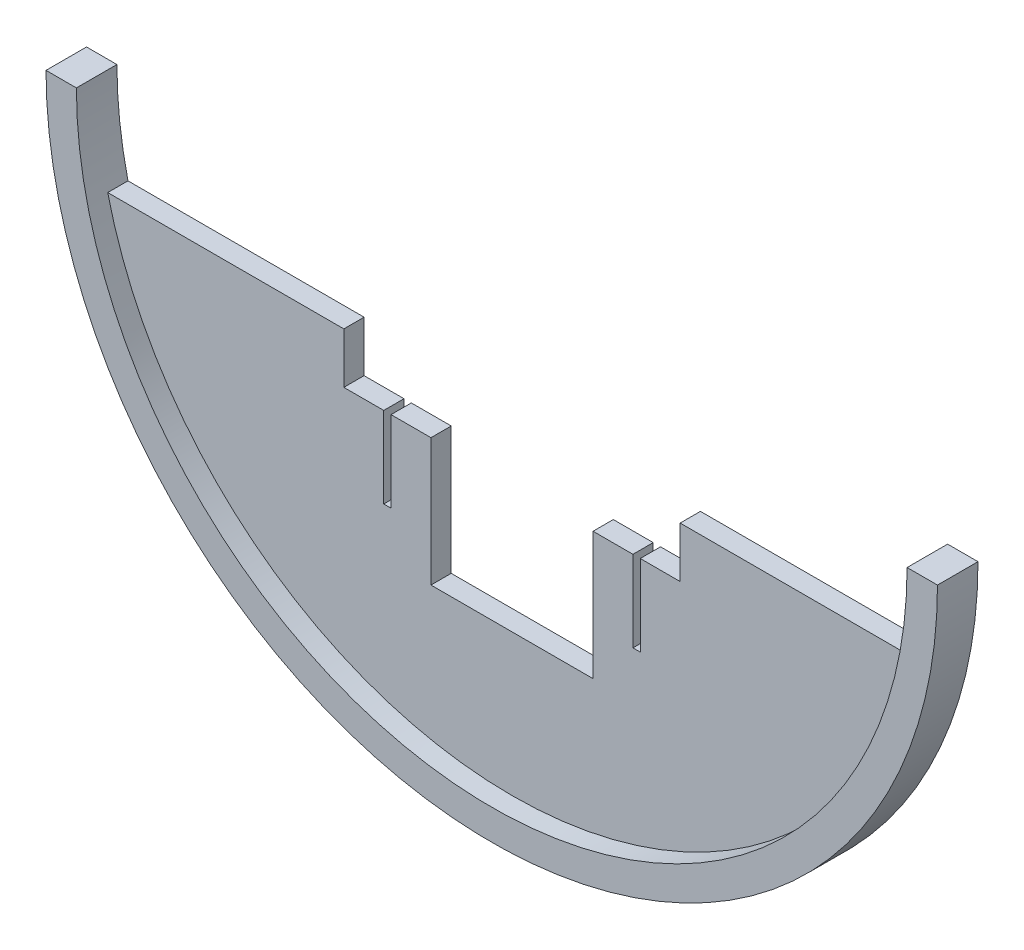
ISO-10303-21;
HEADER;
FILE_DESCRIPTION(('STEP AP214'),'2;1');
FILE_NAME('part.step','',(''),(''),'','','');
FILE_SCHEMA(('AUTOMOTIVE_DESIGN { 1 0 10303 214 1 1 1 1 }'));
ENDSEC;
DATA;
#1=APPLICATION_CONTEXT('core data for automotive mechanical design processes');
#2=APPLICATION_PROTOCOL_DEFINITION('international standard','automotive_design',2000,#1);
#3=PRODUCT_CONTEXT('',#1,'mechanical');
#4=PRODUCT('Part','Part','',(#3));
#5=PRODUCT_RELATED_PRODUCT_CATEGORY('part','',(#4));
#6=PRODUCT_DEFINITION_FORMATION('','',#4);
#7=PRODUCT_DEFINITION_CONTEXT('part definition',#1,'design');
#8=PRODUCT_DEFINITION('design','',#6,#7);
#9=PRODUCT_DEFINITION_SHAPE('','',#8);
#10=(LENGTH_UNIT() NAMED_UNIT(*) SI_UNIT(.MILLI.,.METRE.));
#11=(NAMED_UNIT(*) PLANE_ANGLE_UNIT() SI_UNIT($,.RADIAN.));
#12=(NAMED_UNIT(*) SI_UNIT($,.STERADIAN.) SOLID_ANGLE_UNIT());
#13=UNCERTAINTY_MEASURE_WITH_UNIT(LENGTH_MEASURE(1.E-05),#10,'distance_accuracy_value','');
#14=(GEOMETRIC_REPRESENTATION_CONTEXT(3) GLOBAL_UNCERTAINTY_ASSIGNED_CONTEXT((#13)) GLOBAL_UNIT_ASSIGNED_CONTEXT((#10,
#11,#12)) REPRESENTATION_CONTEXT('',''));
#15=CARTESIAN_POINT('',(0.,0.,0.));
#16=DIRECTION('',(0.,0.,1.));
#17=DIRECTION('',(1.,0.,0.));
#18=AXIS2_PLACEMENT_3D('',#15,#16,#17);
#19=CARTESIAN_POINT('',(0.,5.82014925373134,20.));
#20=DIRECTION('',(0.,1.,0.));
#21=DIRECTION('',(0.,0.,1.));
#22=AXIS2_PLACEMENT_3D('',#19,#20,#21);
#23=PLANE('',#22);
#24=DIRECTION('',(0.,0.,-1.));
#25=VECTOR('',#24,1.);
#26=CARTESIAN_POINT('',(272.3700514361,5.82014925373134,20.));
#27=LINE('',#26,#25);
#28=CARTESIAN_POINT('',(272.3700514361,5.82014925373134,10.));
#29=VERTEX_POINT('',#28);
#30=CARTESIAN_POINT('',(272.3700514361,5.82014925373134,0.));
#31=VERTEX_POINT('',#30);
#32=EDGE_CURVE('E215',#29,#31,#27,.T.);
#33=ORIENTED_EDGE('',*,*,#32,.F.);
#34=DIRECTION('',(-1.,0.,0.));
#35=VECTOR('',#34,1.);
#36=CARTESIAN_POINT('',(272.3700514361,5.82014925373134,10.));
#37=LINE('',#36,#35);
#38=CARTESIAN_POINT('',(388.909521215891,5.82014925373133,10.));
#39=VERTEX_POINT('',#38);
#40=EDGE_CURVE('E201',#39,#29,#37,.T.);
#41=ORIENTED_EDGE('',*,*,#40,.F.);
#42=DIRECTION('',(0.,0.,-1.));
#43=VECTOR('',#42,1.);
#44=CARTESIAN_POINT('',(388.909521215891,5.82014925373133,20.));
#45=LINE('',#44,#43);
#46=CARTESIAN_POINT('',(388.909521215891,5.82014925373133,0.));
#47=VERTEX_POINT('',#46);
#48=EDGE_CURVE('E213',#39,#47,#45,.T.);
#49=ORIENTED_EDGE('',*,*,#48,.T.);
#50=DIRECTION('',(1.,0.,0.));
#51=VECTOR('',#50,1.);
#52=CARTESIAN_POINT('',(0.,5.82014925373134,0.));
#53=LINE('',#52,#51);
#54=EDGE_CURVE('E353',#31,#47,#53,.T.);
#55=ORIENTED_EDGE('',*,*,#54,.F.);
#56=EDGE_LOOP('',(#33,#41,#49,#55));
#57=FACE_BOUND('',#56,.T.);
#58=ADVANCED_FACE('F44',(#57),#23,.T.);
#59=CARTESIAN_POINT('',(272.3700514361,0.,20.));
#60=DIRECTION('',(-1.,0.,0.));
#61=DIRECTION('',(0.,0.,1.));
#62=AXIS2_PLACEMENT_3D('',#59,#60,#61);
#63=PLANE('',#62);
#64=DIRECTION('',(0.,0.,-1.));
#65=VECTOR('',#64,1.);
#66=CARTESIAN_POINT('',(272.3700514361,-19.1798507462687,20.));
#67=LINE('',#66,#65);
#68=CARTESIAN_POINT('',(272.3700514361,-19.1798507462687,10.));
#69=VERTEX_POINT('',#68);
#70=CARTESIAN_POINT('',(272.3700514361,-19.1798507462687,0.));
#71=VERTEX_POINT('',#70);
#72=EDGE_CURVE('E228',#69,#71,#67,.T.);
#73=ORIENTED_EDGE('',*,*,#72,.F.);
#74=DIRECTION('',(0.,-1.,0.));
#75=VECTOR('',#74,1.);
#76=CARTESIAN_POINT('',(272.3700514361,-19.1798507462687,10.));
#77=LINE('',#76,#75);
#78=EDGE_CURVE('E217',#29,#69,#77,.T.);
#79=ORIENTED_EDGE('',*,*,#78,.F.);
#80=ORIENTED_EDGE('',*,*,#32,.T.);
#81=DIRECTION('',(0.,1.,0.));
#82=VECTOR('',#81,1.);
#83=CARTESIAN_POINT('',(272.3700514361,0.,0.));
#84=LINE('',#83,#82);
#85=EDGE_CURVE('E349',#71,#31,#84,.T.);
#86=ORIENTED_EDGE('',*,*,#85,.F.);
#87=EDGE_LOOP('',(#73,#79,#80,#86));
#88=FACE_BOUND('',#87,.T.);
#89=ADVANCED_FACE('F432',(#88),#63,.T.);
#90=CARTESIAN_POINT('',(0.,-19.1798507462687,20.));
#91=DIRECTION('',(0.,1.,0.));
#92=DIRECTION('',(0.,0.,1.));
#93=AXIS2_PLACEMENT_3D('',#90,#91,#92);
#94=PLANE('',#93);
#95=DIRECTION('',(0.,0.,-1.));
#96=VECTOR('',#95,1.);
#97=CARTESIAN_POINT('',(252.6700514361,-19.1798507462687,20.));
#98=LINE('',#97,#96);
#99=CARTESIAN_POINT('',(252.6700514361,-19.1798507462687,10.));
#100=VERTEX_POINT('',#99);
#101=CARTESIAN_POINT('',(252.6700514361,-19.1798507462687,0.));
#102=VERTEX_POINT('',#101);
#103=EDGE_CURVE('E233',#100,#102,#98,.T.);
#104=ORIENTED_EDGE('',*,*,#103,.F.);
#105=DIRECTION('',(-1.,0.,0.));
#106=VECTOR('',#105,1.);
#107=CARTESIAN_POINT('',(252.6700514361,-19.1798507462687,10.));
#108=LINE('',#107,#106);
#109=EDGE_CURVE('E419',#69,#100,#108,.T.);
#110=ORIENTED_EDGE('',*,*,#109,.F.);
#111=ORIENTED_EDGE('',*,*,#72,.T.);
#112=DIRECTION('',(1.,0.,0.));
#113=VECTOR('',#112,1.);
#114=CARTESIAN_POINT('',(0.,-19.1798507462687,0.));
#115=LINE('',#114,#113);
#116=EDGE_CURVE('E345',#102,#71,#115,.T.);
#117=ORIENTED_EDGE('',*,*,#116,.F.);
#118=EDGE_LOOP('',(#104,#110,#111,#117));
#119=FACE_BOUND('',#118,.T.);
#120=ADVANCED_FACE('F429',(#119),#94,.T.);
#121=CARTESIAN_POINT('',(252.6700514361,0.,20.));
#122=DIRECTION('',(1.,0.,0.));
#123=DIRECTION('',(0.,0.,-1.));
#124=AXIS2_PLACEMENT_3D('',#121,#122,#123);
#125=PLANE('',#124);
#126=DIRECTION('',(0.,-1.,0.));
#127=VECTOR('',#126,1.);
#128=CARTESIAN_POINT('',(252.6700514361,-59.1798507462687,10.));
#129=LINE('',#128,#127);
#130=CARTESIAN_POINT('',(252.6700514361,-59.1798507462687,10.));
#131=VERTEX_POINT('',#130);
#132=EDGE_CURVE('E416',#100,#131,#129,.T.);
#133=ORIENTED_EDGE('',*,*,#132,.F.);
#134=ORIENTED_EDGE('',*,*,#103,.T.);
#135=DIRECTION('',(0.,-1.,0.));
#136=VECTOR('',#135,1.);
#137=CARTESIAN_POINT('',(252.6700514361,0.,0.));
#138=LINE('',#137,#136);
#139=CARTESIAN_POINT('',(252.6700514361,-59.1798507462687,0.));
#140=VERTEX_POINT('',#139);
#141=EDGE_CURVE('E341',#102,#140,#138,.T.);
#142=ORIENTED_EDGE('',*,*,#141,.T.);
#143=DIRECTION('',(0.,0.,-1.));
#144=VECTOR('',#143,1.);
#145=CARTESIAN_POINT('',(252.6700514361,-59.1798507462687,20.));
#146=LINE('',#145,#144);
#147=EDGE_CURVE('E236',#131,#140,#146,.T.);
#148=ORIENTED_EDGE('',*,*,#147,.F.);
#149=EDGE_LOOP('',(#133,#134,#142,#148));
#150=FACE_BOUND('',#149,.T.);
#151=ADVANCED_FACE('F440',(#150),#125,.F.);
#152=CARTESIAN_POINT('',(0.,-59.1798507462687,20.));
#153=DIRECTION('',(0.,1.,0.));
#154=DIRECTION('',(0.,0.,1.));
#155=AXIS2_PLACEMENT_3D('',#152,#153,#154);
#156=PLANE('',#155);
#157=DIRECTION('',(0.,0.,-1.));
#158=VECTOR('',#157,1.);
#159=CARTESIAN_POINT('',(249.0700514361,-59.1798507462687,20.));
#160=LINE('',#159,#158);
#161=CARTESIAN_POINT('',(249.0700514361,-59.1798507462687,10.));
#162=VERTEX_POINT('',#161);
#163=CARTESIAN_POINT('',(249.0700514361,-59.1798507462687,0.));
#164=VERTEX_POINT('',#163);
#165=EDGE_CURVE('E239',#162,#164,#160,.T.);
#166=ORIENTED_EDGE('',*,*,#165,.F.);
#167=DIRECTION('',(-1.,0.,0.));
#168=VECTOR('',#167,1.);
#169=CARTESIAN_POINT('',(249.0700514361,-59.1798507462687,10.));
#170=LINE('',#169,#168);
#171=EDGE_CURVE('E413',#131,#162,#170,.T.);
#172=ORIENTED_EDGE('',*,*,#171,.F.);
#173=ORIENTED_EDGE('',*,*,#147,.T.);
#174=DIRECTION('',(1.,0.,0.));
#175=VECTOR('',#174,1.);
#176=CARTESIAN_POINT('',(0.,-59.1798507462687,0.));
#177=LINE('',#176,#175);
#178=EDGE_CURVE('E337',#164,#140,#177,.T.);
#179=ORIENTED_EDGE('',*,*,#178,.F.);
#180=EDGE_LOOP('',(#166,#172,#173,#179));
#181=FACE_BOUND('',#180,.T.);
#182=ADVANCED_FACE('F445',(#181),#156,.T.);
#183=CARTESIAN_POINT('',(249.0700514361,0.,20.));
#184=DIRECTION('',(1.,0.,0.));
#185=DIRECTION('',(0.,0.,-1.));
#186=AXIS2_PLACEMENT_3D('',#183,#184,#185);
#187=PLANE('',#186);
#188=DIRECTION('',(0.,0.,-1.));
#189=VECTOR('',#188,1.);
#190=CARTESIAN_POINT('',(249.0700514361,-19.1798507462687,20.));
#191=LINE('',#190,#189);
#192=CARTESIAN_POINT('',(249.0700514361,-19.1798507462687,10.));
#193=VERTEX_POINT('',#192);
#194=CARTESIAN_POINT('',(249.0700514361,-19.1798507462687,0.));
#195=VERTEX_POINT('',#194);
#196=EDGE_CURVE('E242',#193,#195,#191,.T.);
#197=ORIENTED_EDGE('',*,*,#196,.F.);
#198=DIRECTION('',(0.,1.,0.));
#199=VECTOR('',#198,1.);
#200=CARTESIAN_POINT('',(249.0700514361,-19.1798507462687,10.));
#201=LINE('',#200,#199);
#202=EDGE_CURVE('E410',#162,#193,#201,.T.);
#203=ORIENTED_EDGE('',*,*,#202,.F.);
#204=ORIENTED_EDGE('',*,*,#165,.T.);
#205=DIRECTION('',(0.,-1.,0.));
#206=VECTOR('',#205,1.);
#207=CARTESIAN_POINT('',(249.0700514361,0.,0.));
#208=LINE('',#207,#206);
#209=EDGE_CURVE('E333',#195,#164,#208,.T.);
#210=ORIENTED_EDGE('',*,*,#209,.F.);
#211=EDGE_LOOP('',(#197,#203,#204,#210));
#212=FACE_BOUND('',#211,.T.);
#213=ADVANCED_FACE('F449',(#212),#187,.T.);
#214=CARTESIAN_POINT('',(0.,-19.1798507462687,20.));
#215=DIRECTION('',(0.,1.,0.));
#216=DIRECTION('',(0.,0.,1.));
#217=AXIS2_PLACEMENT_3D('',#214,#215,#216);
#218=PLANE('',#217);
#219=DIRECTION('',(0.,0.,-1.));
#220=VECTOR('',#219,1.);
#221=CARTESIAN_POINT('',(229.3700514361,-19.1798507462687,20.));
#222=LINE('',#221,#220);
#223=CARTESIAN_POINT('',(229.3700514361,-19.1798507462687,10.));
#224=VERTEX_POINT('',#223);
#225=CARTESIAN_POINT('',(229.3700514361,-19.1798507462687,0.));
#226=VERTEX_POINT('',#225);
#227=EDGE_CURVE('E245',#224,#226,#222,.T.);
#228=ORIENTED_EDGE('',*,*,#227,.F.);
#229=DIRECTION('',(-1.,0.,0.));
#230=VECTOR('',#229,1.);
#231=CARTESIAN_POINT('',(229.3700514361,-19.1798507462687,10.));
#232=LINE('',#231,#230);
#233=EDGE_CURVE('E407',#193,#224,#232,.T.);
#234=ORIENTED_EDGE('',*,*,#233,.F.);
#235=ORIENTED_EDGE('',*,*,#196,.T.);
#236=DIRECTION('',(1.,0.,0.));
#237=VECTOR('',#236,1.);
#238=CARTESIAN_POINT('',(0.,-19.1798507462687,0.));
#239=LINE('',#238,#237);
#240=EDGE_CURVE('E329',#226,#195,#239,.T.);
#241=ORIENTED_EDGE('',*,*,#240,.F.);
#242=EDGE_LOOP('',(#228,#234,#235,#241));
#243=FACE_BOUND('',#242,.T.);
#244=ADVANCED_FACE('F454',(#243),#218,.T.);
#245=CARTESIAN_POINT('',(229.3700514361,0.,20.));
#246=DIRECTION('',(-1.,0.,0.));
#247=DIRECTION('',(0.,0.,1.));
#248=AXIS2_PLACEMENT_3D('',#245,#246,#247);
#249=PLANE('',#248);
#250=DIRECTION('',(0.,0.,-1.));
#251=VECTOR('',#250,1.);
#252=CARTESIAN_POINT('',(229.3700514361,-82.1798507462686,20.));
#253=LINE('',#252,#251);
#254=CARTESIAN_POINT('',(229.3700514361,-82.1798507462686,10.));
#255=VERTEX_POINT('',#254);
#256=CARTESIAN_POINT('',(229.3700514361,-82.1798507462686,0.));
#257=VERTEX_POINT('',#256);
#258=EDGE_CURVE('E248',#255,#257,#253,.T.);
#259=ORIENTED_EDGE('',*,*,#258,.F.);
#260=DIRECTION('',(0.,-1.,0.));
#261=VECTOR('',#260,1.);
#262=CARTESIAN_POINT('',(229.3700514361,-82.1798507462686,10.));
#263=LINE('',#262,#261);
#264=EDGE_CURVE('E404',#224,#255,#263,.T.);
#265=ORIENTED_EDGE('',*,*,#264,.F.);
#266=ORIENTED_EDGE('',*,*,#227,.T.);
#267=DIRECTION('',(0.,1.,0.));
#268=VECTOR('',#267,1.);
#269=CARTESIAN_POINT('',(229.3700514361,0.,0.));
#270=LINE('',#269,#268);
#271=EDGE_CURVE('E325',#257,#226,#270,.T.);
#272=ORIENTED_EDGE('',*,*,#271,.F.);
#273=EDGE_LOOP('',(#259,#265,#266,#272));
#274=FACE_BOUND('',#273,.T.);
#275=ADVANCED_FACE('F459',(#274),#249,.T.);
#276=CARTESIAN_POINT('',(0.,-82.1798507462687,20.));
#277=DIRECTION('',(0.,1.,0.));
#278=DIRECTION('',(-1.,0.,0.));
#279=AXIS2_PLACEMENT_3D('',#276,#277,#278);
#280=PLANE('',#279);
#281=DIRECTION('',(0.,0.,-1.));
#282=VECTOR('',#281,1.);
#283=CARTESIAN_POINT('',(149.3700514361,-82.1798507462687,20.));
#284=LINE('',#283,#282);
#285=CARTESIAN_POINT('',(149.3700514361,-82.1798507462687,10.));
#286=VERTEX_POINT('',#285);
#287=CARTESIAN_POINT('',(149.3700514361,-82.1798507462687,0.));
#288=VERTEX_POINT('',#287);
#289=EDGE_CURVE('E251',#286,#288,#284,.T.);
#290=ORIENTED_EDGE('',*,*,#289,.F.);
#291=DIRECTION('',(-1.,0.,0.));
#292=VECTOR('',#291,1.);
#293=CARTESIAN_POINT('',(149.3700514361,-82.1798507462687,10.));
#294=LINE('',#293,#292);
#295=EDGE_CURVE('E401',#255,#286,#294,.T.);
#296=ORIENTED_EDGE('',*,*,#295,.F.);
#297=ORIENTED_EDGE('',*,*,#258,.T.);
#298=DIRECTION('',(1.,0.,0.));
#299=VECTOR('',#298,1.);
#300=CARTESIAN_POINT('',(0.,-82.1798507462687,0.));
#301=LINE('',#300,#299);
#302=EDGE_CURVE('E321',#288,#257,#301,.T.);
#303=ORIENTED_EDGE('',*,*,#302,.F.);
#304=EDGE_LOOP('',(#290,#296,#297,#303));
#305=FACE_BOUND('',#304,.T.);
#306=ADVANCED_FACE('F464',(#305),#280,.T.);
#307=CARTESIAN_POINT('',(149.3700514361,0.,20.));
#308=DIRECTION('',(-1.,0.,0.));
#309=DIRECTION('',(0.,0.,1.));
#310=AXIS2_PLACEMENT_3D('',#307,#308,#309);
#311=PLANE('',#310);
#312=DIRECTION('',(0.,1.,0.));
#313=VECTOR('',#312,1.);
#314=CARTESIAN_POINT('',(149.3700514361,-19.1798507462687,10.));
#315=LINE('',#314,#313);
#316=CARTESIAN_POINT('',(149.3700514361,-19.1798507462687,10.));
#317=VERTEX_POINT('',#316);
#318=EDGE_CURVE('E398',#286,#317,#315,.T.);
#319=ORIENTED_EDGE('',*,*,#318,.F.);
#320=ORIENTED_EDGE('',*,*,#289,.T.);
#321=DIRECTION('',(0.,1.,0.));
#322=VECTOR('',#321,1.);
#323=CARTESIAN_POINT('',(149.3700514361,0.,0.));
#324=LINE('',#323,#322);
#325=CARTESIAN_POINT('',(149.3700514361,-19.1798507462687,0.));
#326=VERTEX_POINT('',#325);
#327=EDGE_CURVE('E317',#288,#326,#324,.T.);
#328=ORIENTED_EDGE('',*,*,#327,.T.);
#329=DIRECTION('',(0.,0.,-1.));
#330=VECTOR('',#329,1.);
#331=CARTESIAN_POINT('',(149.3700514361,-19.1798507462687,20.));
#332=LINE('',#331,#330);
#333=EDGE_CURVE('E254',#317,#326,#332,.T.);
#334=ORIENTED_EDGE('',*,*,#333,.F.);
#335=EDGE_LOOP('',(#319,#320,#328,#334));
#336=FACE_BOUND('',#335,.T.);
#337=ADVANCED_FACE('F468',(#336),#311,.F.);
#338=CARTESIAN_POINT('',(0.,-19.1798507462687,20.));
#339=DIRECTION('',(0.,-1.,0.));
#340=DIRECTION('',(1.,0.,0.));
#341=AXIS2_PLACEMENT_3D('',#338,#339,#340);
#342=PLANE('',#341);
#343=DIRECTION('',(-1.,0.,0.));
#344=VECTOR('',#343,1.);
#345=CARTESIAN_POINT('',(129.6700514361,-19.1798507462687,10.));
#346=LINE('',#345,#344);
#347=CARTESIAN_POINT('',(129.6700514361,-19.1798507462687,10.));
#348=VERTEX_POINT('',#347);
#349=EDGE_CURVE('E395',#317,#348,#346,.T.);
#350=ORIENTED_EDGE('',*,*,#349,.F.);
#351=ORIENTED_EDGE('',*,*,#333,.T.);
#352=DIRECTION('',(-1.,0.,0.));
#353=VECTOR('',#352,1.);
#354=CARTESIAN_POINT('',(0.,-19.1798507462687,0.));
#355=LINE('',#354,#353);
#356=CARTESIAN_POINT('',(129.6700514361,-19.1798507462687,0.));
#357=VERTEX_POINT('',#356);
#358=EDGE_CURVE('E313',#326,#357,#355,.T.);
#359=ORIENTED_EDGE('',*,*,#358,.T.);
#360=DIRECTION('',(0.,0.,-1.));
#361=VECTOR('',#360,1.);
#362=CARTESIAN_POINT('',(129.6700514361,-19.1798507462687,20.));
#363=LINE('',#362,#361);
#364=EDGE_CURVE('E257',#348,#357,#363,.T.);
#365=ORIENTED_EDGE('',*,*,#364,.F.);
#366=EDGE_LOOP('',(#350,#351,#359,#365));
#367=FACE_BOUND('',#366,.T.);
#368=ADVANCED_FACE('F475',(#367),#342,.F.);
#369=CARTESIAN_POINT('',(129.6700514361,0.,20.));
#370=DIRECTION('',(1.,0.,0.));
#371=DIRECTION('',(0.,0.,-1.));
#372=AXIS2_PLACEMENT_3D('',#369,#370,#371);
#373=PLANE('',#372);
#374=DIRECTION('',(0.,-1.,0.));
#375=VECTOR('',#374,1.);
#376=CARTESIAN_POINT('',(129.6700514361,-59.1798507462687,10.));
#377=LINE('',#376,#375);
#378=CARTESIAN_POINT('',(129.6700514361,-59.1798507462687,10.));
#379=VERTEX_POINT('',#378);
#380=EDGE_CURVE('E392',#348,#379,#377,.T.);
#381=ORIENTED_EDGE('',*,*,#380,.F.);
#382=ORIENTED_EDGE('',*,*,#364,.T.);
#383=DIRECTION('',(0.,-1.,0.));
#384=VECTOR('',#383,1.);
#385=CARTESIAN_POINT('',(129.6700514361,0.,0.));
#386=LINE('',#385,#384);
#387=CARTESIAN_POINT('',(129.6700514361,-59.1798507462687,0.));
#388=VERTEX_POINT('',#387);
#389=EDGE_CURVE('E309',#357,#388,#386,.T.);
#390=ORIENTED_EDGE('',*,*,#389,.T.);
#391=DIRECTION('',(0.,0.,-1.));
#392=VECTOR('',#391,1.);
#393=CARTESIAN_POINT('',(129.6700514361,-59.1798507462687,20.));
#394=LINE('',#393,#392);
#395=EDGE_CURVE('E260',#379,#388,#394,.T.);
#396=ORIENTED_EDGE('',*,*,#395,.F.);
#397=EDGE_LOOP('',(#381,#382,#390,#396));
#398=FACE_BOUND('',#397,.T.);
#399=ADVANCED_FACE('F480',(#398),#373,.F.);
#400=CARTESIAN_POINT('',(0.,-59.1798507462687,20.));
#401=DIRECTION('',(0.,1.,0.));
#402=DIRECTION('',(0.,0.,1.));
#403=AXIS2_PLACEMENT_3D('',#400,#401,#402);
#404=PLANE('',#403);
#405=DIRECTION('',(0.,0.,-1.));
#406=VECTOR('',#405,1.);
#407=CARTESIAN_POINT('',(126.0700514361,-59.1798507462687,20.));
#408=LINE('',#407,#406);
#409=CARTESIAN_POINT('',(126.0700514361,-59.1798507462687,10.));
#410=VERTEX_POINT('',#409);
#411=CARTESIAN_POINT('',(126.0700514361,-59.1798507462687,0.));
#412=VERTEX_POINT('',#411);
#413=EDGE_CURVE('E263',#410,#412,#408,.T.);
#414=ORIENTED_EDGE('',*,*,#413,.F.);
#415=DIRECTION('',(-1.,0.,0.));
#416=VECTOR('',#415,1.);
#417=CARTESIAN_POINT('',(126.0700514361,-59.1798507462687,10.));
#418=LINE('',#417,#416);
#419=EDGE_CURVE('E389',#379,#410,#418,.T.);
#420=ORIENTED_EDGE('',*,*,#419,.F.);
#421=ORIENTED_EDGE('',*,*,#395,.T.);
#422=DIRECTION('',(1.,0.,0.));
#423=VECTOR('',#422,1.);
#424=CARTESIAN_POINT('',(0.,-59.1798507462687,0.));
#425=LINE('',#424,#423);
#426=EDGE_CURVE('E305',#412,#388,#425,.T.);
#427=ORIENTED_EDGE('',*,*,#426,.F.);
#428=EDGE_LOOP('',(#414,#420,#421,#427));
#429=FACE_BOUND('',#428,.T.);
#430=ADVANCED_FACE('F484',(#429),#404,.T.);
#431=CARTESIAN_POINT('',(126.0700514361,0.,20.));
#432=DIRECTION('',(1.,0.,0.));
#433=DIRECTION('',(0.,0.,-1.));
#434=AXIS2_PLACEMENT_3D('',#431,#432,#433);
#435=PLANE('',#434);
#436=DIRECTION('',(0.,0.,-1.));
#437=VECTOR('',#436,1.);
#438=CARTESIAN_POINT('',(126.0700514361,-19.1798507462687,20.));
#439=LINE('',#438,#437);
#440=CARTESIAN_POINT('',(126.0700514361,-19.1798507462687,10.));
#441=VERTEX_POINT('',#440);
#442=CARTESIAN_POINT('',(126.0700514361,-19.1798507462687,0.));
#443=VERTEX_POINT('',#442);
#444=EDGE_CURVE('E266',#441,#443,#439,.T.);
#445=ORIENTED_EDGE('',*,*,#444,.F.);
#446=DIRECTION('',(0.,1.,0.));
#447=VECTOR('',#446,1.);
#448=CARTESIAN_POINT('',(126.0700514361,-19.1798507462687,10.));
#449=LINE('',#448,#447);
#450=EDGE_CURVE('E386',#410,#441,#449,.T.);
#451=ORIENTED_EDGE('',*,*,#450,.F.);
#452=ORIENTED_EDGE('',*,*,#413,.T.);
#453=DIRECTION('',(0.,-1.,0.));
#454=VECTOR('',#453,1.);
#455=CARTESIAN_POINT('',(126.0700514361,0.,0.));
#456=LINE('',#455,#454);
#457=EDGE_CURVE('E301',#443,#412,#456,.T.);
#458=ORIENTED_EDGE('',*,*,#457,.F.);
#459=EDGE_LOOP('',(#445,#451,#452,#458));
#460=FACE_BOUND('',#459,.T.);
#461=ADVANCED_FACE('F489',(#460),#435,.T.);
#462=CARTESIAN_POINT('',(0.,-19.1798507462687,20.));
#463=DIRECTION('',(0.,-1.,0.));
#464=DIRECTION('',(0.,0.,-1.));
#465=AXIS2_PLACEMENT_3D('',#462,#463,#464);
#466=PLANE('',#465);
#467=DIRECTION('',(-1.,0.,0.));
#468=VECTOR('',#467,1.);
#469=CARTESIAN_POINT('',(106.3700514361,-19.1798507462687,10.));
#470=LINE('',#469,#468);
#471=CARTESIAN_POINT('',(106.3700514361,-19.1798507462687,10.));
#472=VERTEX_POINT('',#471);
#473=EDGE_CURVE('E383',#441,#472,#470,.T.);
#474=ORIENTED_EDGE('',*,*,#473,.F.);
#475=ORIENTED_EDGE('',*,*,#444,.T.);
#476=DIRECTION('',(-1.,0.,0.));
#477=VECTOR('',#476,1.);
#478=CARTESIAN_POINT('',(0.,-19.1798507462687,0.));
#479=LINE('',#478,#477);
#480=CARTESIAN_POINT('',(106.3700514361,-19.1798507462687,0.));
#481=VERTEX_POINT('',#480);
#482=EDGE_CURVE('E297',#443,#481,#479,.T.);
#483=ORIENTED_EDGE('',*,*,#482,.T.);
#484=DIRECTION('',(0.,0.,-1.));
#485=VECTOR('',#484,1.);
#486=CARTESIAN_POINT('',(106.3700514361,-19.1798507462687,20.));
#487=LINE('',#486,#485);
#488=EDGE_CURVE('E269',#472,#481,#487,.T.);
#489=ORIENTED_EDGE('',*,*,#488,.F.);
#490=EDGE_LOOP('',(#474,#475,#483,#489));
#491=FACE_BOUND('',#490,.T.);
#492=ADVANCED_FACE('F493',(#491),#466,.F.);
#493=CARTESIAN_POINT('',(106.3700514361,0.,20.));
#494=DIRECTION('',(-1.,0.,0.));
#495=DIRECTION('',(0.,0.,1.));
#496=AXIS2_PLACEMENT_3D('',#493,#494,#495);
#497=PLANE('',#496);
#498=DIRECTION('',(0.,1.,0.));
#499=VECTOR('',#498,1.);
#500=CARTESIAN_POINT('',(106.3700514361,5.82014925373134,10.));
#501=LINE('',#500,#499);
#502=CARTESIAN_POINT('',(106.3700514361,5.82014925373134,10.));
#503=VERTEX_POINT('',#502);
#504=EDGE_CURVE('E380',#472,#503,#501,.T.);
#505=ORIENTED_EDGE('',*,*,#504,.F.);
#506=ORIENTED_EDGE('',*,*,#488,.T.);
#507=DIRECTION('',(0.,1.,0.));
#508=VECTOR('',#507,1.);
#509=CARTESIAN_POINT('',(106.3700514361,0.,0.));
#510=LINE('',#509,#508);
#511=CARTESIAN_POINT('',(106.3700514361,5.82014925373134,0.));
#512=VERTEX_POINT('',#511);
#513=EDGE_CURVE('E293',#481,#512,#510,.T.);
#514=ORIENTED_EDGE('',*,*,#513,.T.);
#515=DIRECTION('',(0.,0.,-1.));
#516=VECTOR('',#515,1.);
#517=CARTESIAN_POINT('',(106.3700514361,5.82014925373134,20.));
#518=LINE('',#517,#516);
#519=EDGE_CURVE('E272',#503,#512,#518,.T.);
#520=ORIENTED_EDGE('',*,*,#519,.F.);
#521=EDGE_LOOP('',(#505,#506,#514,#520));
#522=FACE_BOUND('',#521,.T.);
#523=ADVANCED_FACE('F500',(#522),#497,.F.);
#524=CARTESIAN_POINT('',(0.,5.82014925373134,20.));
#525=DIRECTION('',(0.,-1.,0.));
#526=DIRECTION('',(0.,0.,-1.));
#527=AXIS2_PLACEMENT_3D('',#524,#525,#526);
#528=PLANE('',#527);
#529=DIRECTION('',(-1.,0.,0.));
#530=VECTOR('',#529,1.);
#531=CARTESIAN_POINT('',(-10.1694183436908,5.82014925373133,10.));
#532=LINE('',#531,#530);
#533=CARTESIAN_POINT('',(-10.1694183436908,5.82014925373133,10.));
#534=VERTEX_POINT('',#533);
#535=EDGE_CURVE('E204',#503,#534,#532,.T.);
#536=ORIENTED_EDGE('',*,*,#535,.F.);
#537=ORIENTED_EDGE('',*,*,#519,.T.);
#538=DIRECTION('',(-1.,0.,0.));
#539=VECTOR('',#538,1.);
#540=CARTESIAN_POINT('',(0.,5.82014925373134,0.));
#541=LINE('',#540,#539);
#542=CARTESIAN_POINT('',(-10.1694183436908,5.82014925373133,0.));
#543=VERTEX_POINT('',#542);
#544=EDGE_CURVE('E289',#512,#543,#541,.T.);
#545=ORIENTED_EDGE('',*,*,#544,.T.);
#546=DIRECTION('',(0.,0.,-1.));
#547=VECTOR('',#546,1.);
#548=CARTESIAN_POINT('',(-10.1694183436908,5.82014925373133,20.));
#549=LINE('',#548,#547);
#550=EDGE_CURVE('E275',#534,#543,#549,.T.);
#551=ORIENTED_EDGE('',*,*,#550,.F.);
#552=EDGE_LOOP('',(#536,#537,#545,#551));
#553=FACE_BOUND('',#552,.T.);
#554=ADVANCED_FACE('F502',(#553),#528,.F.);
#555=CARTESIAN_POINT('',(189.3700514361,52.8201492537313,20.));
#556=DIRECTION('',(0.,0.,-1.));
#557=DIRECTION('',(-1.,0.,0.));
#558=AXIS2_PLACEMENT_3D('',#555,#556,#557);
#559=CYLINDRICAL_SURFACE('',#558,220.);
#560=CARTESIAN_POINT('',(189.3700514361,52.8201492537313,0.));
#561=DIRECTION('',(0.,0.,1.));
#562=DIRECTION('',(1.,0.,0.));
#563=AXIS2_PLACEMENT_3D('',#560,#561,#562);
#564=CIRCLE('',#563,220.);
#565=CARTESIAN_POINT('',(-30.6299485639,52.8201492537313,0.));
#566=VERTEX_POINT('',#565);
#567=CARTESIAN_POINT('',(409.3700514361,52.8201492537314,0.));
#568=VERTEX_POINT('',#567);
#569=EDGE_CURVE('E362',#566,#568,#564,.T.);
#570=ORIENTED_EDGE('',*,*,#569,.T.);
#571=DIRECTION('',(0.,0.,-1.));
#572=VECTOR('',#571,1.);
#573=CARTESIAN_POINT('',(409.3700514361,52.8201492537314,20.));
#574=LINE('',#573,#572);
#575=CARTESIAN_POINT('',(409.3700514361,52.8201492537314,20.));
#576=VERTEX_POINT('',#575);
#577=EDGE_CURVE('E11',#576,#568,#574,.T.);
#578=ORIENTED_EDGE('',*,*,#577,.F.);
#579=CARTESIAN_POINT('',(189.3700514361,52.8201492537313,20.));
#580=DIRECTION('',(0.,0.,1.));
#581=DIRECTION('',(1.,0.,0.));
#582=AXIS2_PLACEMENT_3D('',#579,#580,#581);
#583=CIRCLE('',#582,220.);
#584=CARTESIAN_POINT('',(-30.6299485639,52.8201492537313,20.));
#585=VERTEX_POINT('',#584);
#586=EDGE_CURVE('E140',#585,#576,#583,.T.);
#587=ORIENTED_EDGE('',*,*,#586,.F.);
#588=DIRECTION('',(0.,0.,-1.));
#589=VECTOR('',#588,1.);
#590=CARTESIAN_POINT('',(-30.6299485639,52.8201492537313,20.));
#591=LINE('',#590,#589);
#592=EDGE_CURVE('E280',#585,#566,#591,.T.);
#593=ORIENTED_EDGE('',*,*,#592,.T.);
#594=EDGE_LOOP('',(#570,#578,#587,#593));
#595=FACE_BOUND('',#594,.T.);
#596=ADVANCED_FACE('F46',(#595),#559,.T.);
#597=CARTESIAN_POINT('',(-1.95473819552094E-13,52.8201492537299,20.));
#598=DIRECTION('',(0.,1.,0.));
#599=DIRECTION('',(-1.,0.,0.));
#600=AXIS2_PLACEMENT_3D('',#597,#598,#599);
#601=PLANE('',#600);
#602=DIRECTION('',(1.,0.,0.));
#603=VECTOR('',#602,1.);
#604=CARTESIAN_POINT('',(-1.95473819552094E-13,52.8201492537299,0.));
#605=LINE('',#604,#603);
#606=CARTESIAN_POINT('',(394.3700514361,52.8201492537313,0.));
#607=VERTEX_POINT('',#606);
#608=EDGE_CURVE('E358',#607,#568,#605,.T.);
#609=ORIENTED_EDGE('',*,*,#608,.F.);
#610=DIRECTION('',(0.,0.,-1.));
#611=VECTOR('',#610,1.);
#612=CARTESIAN_POINT('',(394.3700514361,52.8201492537313,20.));
#613=LINE('',#612,#611);
#614=CARTESIAN_POINT('',(394.3700514361,52.8201492537313,20.));
#615=VERTEX_POINT('',#614);
#616=EDGE_CURVE('E54',#615,#607,#613,.T.);
#617=ORIENTED_EDGE('',*,*,#616,.F.);
#618=DIRECTION('',(1.,0.,0.));
#619=VECTOR('',#618,1.);
#620=CARTESIAN_POINT('',(-1.95473819552094E-13,52.8201492537299,20.));
#621=LINE('',#620,#619);
#622=EDGE_CURVE('E372',#615,#576,#621,.T.);
#623=ORIENTED_EDGE('',*,*,#622,.T.);
#624=ORIENTED_EDGE('',*,*,#577,.T.);
#625=EDGE_LOOP('',(#609,#617,#623,#624));
#626=FACE_BOUND('',#625,.T.);
#627=ADVANCED_FACE('F514',(#626),#601,.T.);
#628=CARTESIAN_POINT('',(189.3700514361,52.8201492537313,20.));
#629=DIRECTION('',(0.,0.,-1.));
#630=DIRECTION('',(-1.,0.,0.));
#631=AXIS2_PLACEMENT_3D('',#628,#629,#630);
#632=CYLINDRICAL_SURFACE('',#631,205.);
#633=CARTESIAN_POINT('',(189.3700514361,52.8201492537313,0.));
#634=DIRECTION('',(0.,0.,1.));
#635=DIRECTION('',(1.,0.,0.));
#636=AXIS2_PLACEMENT_3D('',#633,#634,#635);
#637=CIRCLE('',#636,205.);
#638=CARTESIAN_POINT('',(-15.6299485639,52.8201492537313,0.));
#639=VERTEX_POINT('',#638);
#640=EDGE_CURVE('E285',#639,#543,#637,.T.);
#641=ORIENTED_EDGE('',*,*,#640,.F.);
#642=DIRECTION('',(0.,0.,-1.));
#643=VECTOR('',#642,1.);
#644=CARTESIAN_POINT('',(-15.6299485639,52.8201492537313,20.));
#645=LINE('',#644,#643);
#646=CARTESIAN_POINT('',(-15.6299485639,52.8201492537313,20.));
#647=VERTEX_POINT('',#646);
#648=EDGE_CURVE('E132',#647,#639,#645,.T.);
#649=ORIENTED_EDGE('',*,*,#648,.F.);
#650=CARTESIAN_POINT('',(189.3700514361,52.8201492537313,20.));
#651=DIRECTION('',(0.,0.,1.));
#652=DIRECTION('',(1.,0.,0.));
#653=AXIS2_PLACEMENT_3D('',#650,#651,#652);
#654=CIRCLE('',#653,205.);
#655=EDGE_CURVE('E368',#647,#615,#654,.T.);
#656=ORIENTED_EDGE('',*,*,#655,.T.);
#657=ORIENTED_EDGE('',*,*,#616,.T.);
#658=CARTESIAN_POINT('',(189.3700514361,52.8201492537313,0.));
#659=DIRECTION('',(0.,0.,1.));
#660=DIRECTION('',(1.,0.,0.));
#661=AXIS2_PLACEMENT_3D('',#658,#659,#660);
#662=CIRCLE('',#661,205.);
#663=EDGE_CURVE('E222',#47,#607,#662,.T.);
#664=ORIENTED_EDGE('',*,*,#663,.F.);
#665=ORIENTED_EDGE('',*,*,#48,.F.);
#666=CARTESIAN_POINT('',(189.3700514361,52.8201492537313,10.));
#667=DIRECTION('',(0.,0.,1.));
#668=DIRECTION('',(1.,0.,0.));
#669=AXIS2_PLACEMENT_3D('',#666,#667,#668);
#670=CIRCLE('',#669,205.);
#671=EDGE_CURVE('E198',#534,#39,#670,.T.);
#672=ORIENTED_EDGE('',*,*,#671,.F.);
#673=ORIENTED_EDGE('',*,*,#550,.T.);
#674=EDGE_LOOP('',(#641,#649,#656,#657,#664,#665,#672,#673));
#675=FACE_BOUND('',#674,.T.);
#676=ADVANCED_FACE('F220',(#675),#632,.F.);
#677=CARTESIAN_POINT('',(0.,52.8201492537313,20.));
#678=DIRECTION('',(0.,-1.,0.));
#679=DIRECTION('',(0.,0.,-1.));
#680=AXIS2_PLACEMENT_3D('',#677,#678,#679);
#681=PLANE('',#680);
#682=DIRECTION('',(-1.,0.,0.));
#683=VECTOR('',#682,1.);
#684=CARTESIAN_POINT('',(0.,52.8201492537313,0.));
#685=LINE('',#684,#683);
#686=EDGE_CURVE('E135',#639,#566,#685,.T.);
#687=ORIENTED_EDGE('',*,*,#686,.T.);
#688=ORIENTED_EDGE('',*,*,#592,.F.);
#689=DIRECTION('',(-1.,0.,0.));
#690=VECTOR('',#689,1.);
#691=CARTESIAN_POINT('',(0.,52.8201492537313,20.));
#692=LINE('',#691,#690);
#693=EDGE_CURVE('E62',#647,#585,#692,.T.);
#694=ORIENTED_EDGE('',*,*,#693,.F.);
#695=ORIENTED_EDGE('',*,*,#648,.T.);
#696=EDGE_LOOP('',(#687,#688,#694,#695));
#697=FACE_BOUND('',#696,.T.);
#698=ADVANCED_FACE('F505',(#697),#681,.F.);
#699=CARTESIAN_POINT('',(0.,0.,20.));
#700=DIRECTION('',(0.,0.,1.));
#701=DIRECTION('',(1.,0.,0.));
#702=AXIS2_PLACEMENT_3D('',#699,#700,#701);
#703=PLANE('',#702);
#704=ORIENTED_EDGE('',*,*,#655,.F.);
#705=ORIENTED_EDGE('',*,*,#693,.T.);
#706=ORIENTED_EDGE('',*,*,#586,.T.);
#707=ORIENTED_EDGE('',*,*,#622,.F.);
#708=EDGE_LOOP('',(#704,#705,#706,#707));
#709=FACE_BOUND('',#708,.T.);
#710=ADVANCED_FACE('F507',(#709),#703,.T.);
#711=CARTESIAN_POINT('',(0.,0.,0.));
#712=DIRECTION('',(0.,0.,1.));
#713=DIRECTION('',(1.,0.,0.));
#714=AXIS2_PLACEMENT_3D('',#711,#712,#713);
#715=PLANE('',#714);
#716=ORIENTED_EDGE('',*,*,#569,.F.);
#717=ORIENTED_EDGE('',*,*,#686,.F.);
#718=ORIENTED_EDGE('',*,*,#640,.T.);
#719=ORIENTED_EDGE('',*,*,#544,.F.);
#720=ORIENTED_EDGE('',*,*,#513,.F.);
#721=ORIENTED_EDGE('',*,*,#482,.F.);
#722=ORIENTED_EDGE('',*,*,#457,.T.);
#723=ORIENTED_EDGE('',*,*,#426,.T.);
#724=ORIENTED_EDGE('',*,*,#389,.F.);
#725=ORIENTED_EDGE('',*,*,#358,.F.);
#726=ORIENTED_EDGE('',*,*,#327,.F.);
#727=ORIENTED_EDGE('',*,*,#302,.T.);
#728=ORIENTED_EDGE('',*,*,#271,.T.);
#729=ORIENTED_EDGE('',*,*,#240,.T.);
#730=ORIENTED_EDGE('',*,*,#209,.T.);
#731=ORIENTED_EDGE('',*,*,#178,.T.);
#732=ORIENTED_EDGE('',*,*,#141,.F.);
#733=ORIENTED_EDGE('',*,*,#116,.T.);
#734=ORIENTED_EDGE('',*,*,#85,.T.);
#735=ORIENTED_EDGE('',*,*,#54,.T.);
#736=ORIENTED_EDGE('',*,*,#663,.T.);
#737=ORIENTED_EDGE('',*,*,#608,.T.);
#738=EDGE_LOOP('',(#716,#717,#718,#719,#720,#721,#722,#723,#724,#725,#726,#727,#728,#729,#730,
#731,#732,#733,#734,#735,#736,#737));
#739=FACE_BOUND('',#738,.T.);
#740=ADVANCED_FACE('F436',(#739),#715,.F.);
#741=CARTESIAN_POINT('',(189.3700514361,52.8201492537313,10.));
#742=DIRECTION('',(0.,0.,1.));
#743=DIRECTION('',(1.,0.,0.));
#744=AXIS2_PLACEMENT_3D('',#741,#742,#743);
#745=PLANE('',#744);
#746=ORIENTED_EDGE('',*,*,#671,.T.);
#747=ORIENTED_EDGE('',*,*,#40,.T.);
#748=ORIENTED_EDGE('',*,*,#78,.T.);
#749=ORIENTED_EDGE('',*,*,#109,.T.);
#750=ORIENTED_EDGE('',*,*,#132,.T.);
#751=ORIENTED_EDGE('',*,*,#171,.T.);
#752=ORIENTED_EDGE('',*,*,#202,.T.);
#753=ORIENTED_EDGE('',*,*,#233,.T.);
#754=ORIENTED_EDGE('',*,*,#264,.T.);
#755=ORIENTED_EDGE('',*,*,#295,.T.);
#756=ORIENTED_EDGE('',*,*,#318,.T.);
#757=ORIENTED_EDGE('',*,*,#349,.T.);
#758=ORIENTED_EDGE('',*,*,#380,.T.);
#759=ORIENTED_EDGE('',*,*,#419,.T.);
#760=ORIENTED_EDGE('',*,*,#450,.T.);
#761=ORIENTED_EDGE('',*,*,#473,.T.);
#762=ORIENTED_EDGE('',*,*,#504,.T.);
#763=ORIENTED_EDGE('',*,*,#535,.T.);
#764=EDGE_LOOP('',(#746,#747,#748,#749,#750,#751,#752,#753,#754,#755,#756,#757,#758,#759,#760,
#761,#762,#763));
#765=FACE_BOUND('',#764,.T.);
#766=ADVANCED_FACE('F200',(#765),#745,.T.);
#767=CLOSED_SHELL('',(#58,#89,#120,#151,#182,#213,#244,#275,#306,#337,#368,#399,#430,#461,#492,
#523,#554,#596,#627,#676,#698,#710,#740,#766));
#768=MANIFOLD_SOLID_BREP('B2',#767);
#769=ADVANCED_BREP_SHAPE_REPRESENTATION('',(#18,#768),#14);
#770=SHAPE_DEFINITION_REPRESENTATION(#9,#769);
ENDSEC;
END-ISO-10303-21;
